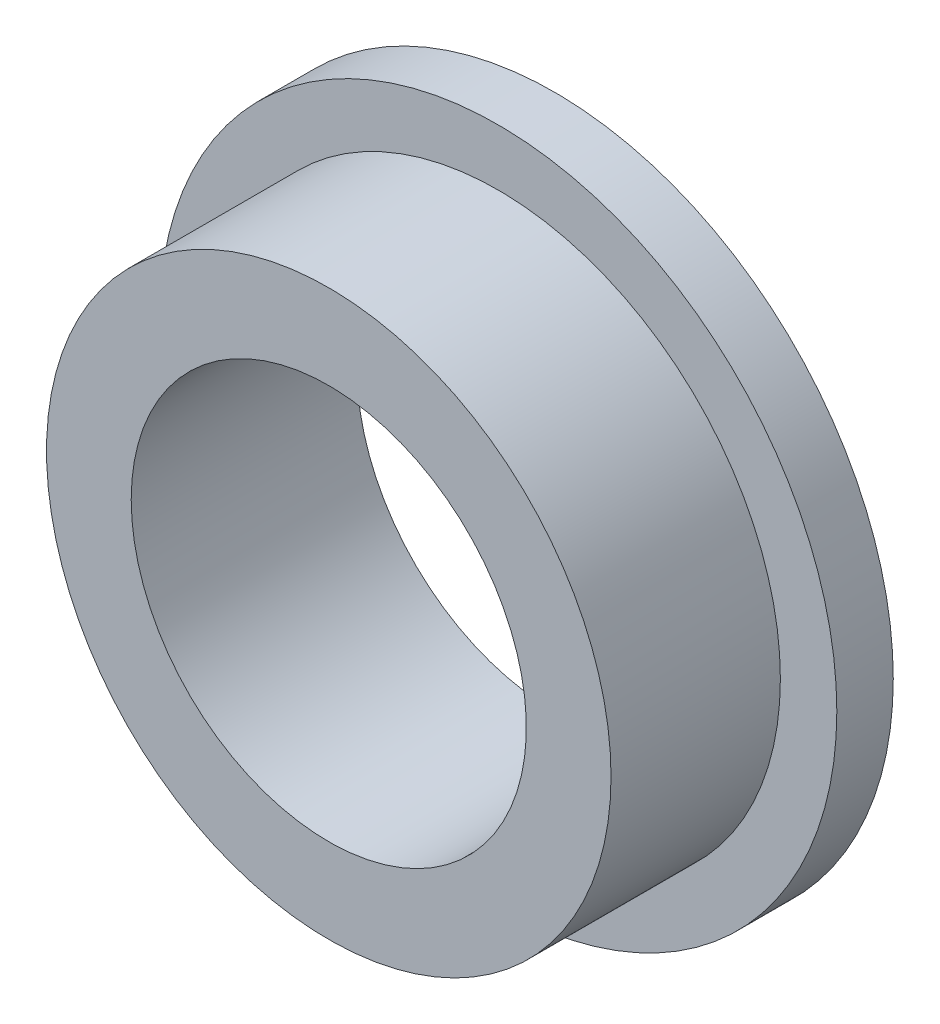
ISO-10303-21;
HEADER;
FILE_DESCRIPTION(('STEP AP214'),'2;1');
FILE_NAME('part.step','',(''),(''),'','','');
FILE_SCHEMA(('AUTOMOTIVE_DESIGN { 1 0 10303 214 1 1 1 1 }'));
ENDSEC;
DATA;
#1=APPLICATION_CONTEXT('core data for automotive mechanical design processes');
#2=APPLICATION_PROTOCOL_DEFINITION('international standard','automotive_design',2000,#1);
#3=PRODUCT_CONTEXT('',#1,'mechanical');
#4=PRODUCT('Part','Part','',(#3));
#5=PRODUCT_RELATED_PRODUCT_CATEGORY('part','',(#4));
#6=PRODUCT_DEFINITION_FORMATION('','',#4);
#7=PRODUCT_DEFINITION_CONTEXT('part definition',#1,'design');
#8=PRODUCT_DEFINITION('design','',#6,#7);
#9=PRODUCT_DEFINITION_SHAPE('','',#8);
#10=(LENGTH_UNIT() NAMED_UNIT(*) SI_UNIT(.MILLI.,.METRE.));
#11=(NAMED_UNIT(*) PLANE_ANGLE_UNIT() SI_UNIT($,.RADIAN.));
#12=(NAMED_UNIT(*) SI_UNIT($,.STERADIAN.) SOLID_ANGLE_UNIT());
#13=UNCERTAINTY_MEASURE_WITH_UNIT(LENGTH_MEASURE(1.E-05),#10,'distance_accuracy_value','');
#14=(GEOMETRIC_REPRESENTATION_CONTEXT(3) GLOBAL_UNCERTAINTY_ASSIGNED_CONTEXT((#13)) GLOBAL_UNIT_ASSIGNED_CONTEXT((#10,
#11,#12)) REPRESENTATION_CONTEXT('',''));
#15=CARTESIAN_POINT('',(0.,0.,0.));
#16=DIRECTION('',(0.,0.,1.));
#17=DIRECTION('',(1.,0.,0.));
#18=AXIS2_PLACEMENT_3D('',#15,#16,#17);
#19=CARTESIAN_POINT('',(0.,0.,1.));
#20=DIRECTION('',(0.,0.,1.));
#21=DIRECTION('',(1.,0.,0.));
#22=AXIS2_PLACEMENT_3D('',#19,#20,#21);
#23=PLANE('',#22);
#24=CARTESIAN_POINT('',(0.,0.,1.));
#25=DIRECTION('',(0.,0.,1.));
#26=DIRECTION('',(1.,0.,0.));
#27=AXIS2_PLACEMENT_3D('',#24,#25,#26);
#28=CIRCLE('',#27,6.);
#29=CARTESIAN_POINT('',(6.,0.,1.));
#30=VERTEX_POINT('',#29);
#31=EDGE_CURVE('E10',#30,#30,#28,.T.);
#32=ORIENTED_EDGE('',*,*,#31,.T.);
#33=EDGE_LOOP('',(#32));
#34=FACE_BOUND('',#33,.T.);
#35=CARTESIAN_POINT('',(0.,0.,1.));
#36=DIRECTION('',(0.,0.,1.));
#37=DIRECTION('',(1.,0.,0.));
#38=AXIS2_PLACEMENT_3D('',#35,#36,#37);
#39=CIRCLE('',#38,5.);
#40=CARTESIAN_POINT('',(5.,0.,1.));
#41=VERTEX_POINT('',#40);
#42=EDGE_CURVE('E45',#41,#41,#39,.T.);
#43=ORIENTED_EDGE('',*,*,#42,.F.);
#44=EDGE_LOOP('',(#43));
#45=FACE_BOUND('',#44,.T.);
#46=ADVANCED_FACE('F32',(#34,#45),#23,.T.);
#47=CARTESIAN_POINT('',(0.,0.,1.));
#48=DIRECTION('',(0.,0.,-1.));
#49=DIRECTION('',(-1.,0.,0.));
#50=AXIS2_PLACEMENT_3D('',#47,#48,#49);
#51=CYLINDRICAL_SURFACE('',#50,6.);
#52=ORIENTED_EDGE('',*,*,#31,.F.);
#53=EDGE_LOOP('',(#52));
#54=FACE_BOUND('',#53,.T.);
#55=CARTESIAN_POINT('',(0.,0.,0.));
#56=DIRECTION('',(0.,0.,1.));
#57=DIRECTION('',(1.,0.,0.));
#58=AXIS2_PLACEMENT_3D('',#55,#56,#57);
#59=CIRCLE('',#58,6.);
#60=CARTESIAN_POINT('',(6.,0.,0.));
#61=VERTEX_POINT('',#60);
#62=EDGE_CURVE('E36',#61,#61,#59,.T.);
#63=ORIENTED_EDGE('',*,*,#62,.T.);
#64=EDGE_LOOP('',(#63));
#65=FACE_BOUND('',#64,.T.);
#66=ADVANCED_FACE('F34',(#54,#65),#51,.T.);
#67=CARTESIAN_POINT('',(0.,0.,0.));
#68=DIRECTION('',(0.,0.,1.));
#69=DIRECTION('',(1.,0.,0.));
#70=AXIS2_PLACEMENT_3D('',#67,#68,#69);
#71=PLANE('',#70);
#72=CARTESIAN_POINT('',(0.,0.,0.));
#73=DIRECTION('',(0.,0.,-1.));
#74=DIRECTION('',(-1.,0.,0.));
#75=AXIS2_PLACEMENT_3D('',#72,#73,#74);
#76=CIRCLE('',#75,3.5);
#77=CARTESIAN_POINT('',(-3.5,0.,0.));
#78=VERTEX_POINT('',#77);
#79=EDGE_CURVE('E51',#78,#78,#76,.T.);
#80=ORIENTED_EDGE('',*,*,#79,.F.);
#81=EDGE_LOOP('',(#80));
#82=FACE_BOUND('',#81,.T.);
#83=ORIENTED_EDGE('',*,*,#62,.F.);
#84=EDGE_LOOP('',(#83));
#85=FACE_BOUND('',#84,.T.);
#86=ADVANCED_FACE('F66',(#82,#85),#71,.F.);
#87=CARTESIAN_POINT('',(0.,0.,4.));
#88=DIRECTION('',(0.,0.,-1.));
#89=DIRECTION('',(-1.,0.,0.));
#90=AXIS2_PLACEMENT_3D('',#87,#88,#89);
#91=CYLINDRICAL_SURFACE('',#90,5.);
#92=CARTESIAN_POINT('',(0.,0.,4.));
#93=DIRECTION('',(0.,0.,1.));
#94=DIRECTION('',(1.,0.,0.));
#95=AXIS2_PLACEMENT_3D('',#92,#93,#94);
#96=CIRCLE('',#95,5.);
#97=CARTESIAN_POINT('',(5.,0.,4.));
#98=VERTEX_POINT('',#97);
#99=EDGE_CURVE('E43',#98,#98,#96,.T.);
#100=ORIENTED_EDGE('',*,*,#99,.F.);
#101=EDGE_LOOP('',(#100));
#102=FACE_BOUND('',#101,.T.);
#103=ORIENTED_EDGE('',*,*,#42,.T.);
#104=EDGE_LOOP('',(#103));
#105=FACE_BOUND('',#104,.T.);
#106=ADVANCED_FACE('F69',(#102,#105),#91,.T.);
#107=CARTESIAN_POINT('',(0.,0.,4.));
#108=DIRECTION('',(0.,0.,1.));
#109=DIRECTION('',(1.,0.,0.));
#110=AXIS2_PLACEMENT_3D('',#107,#108,#109);
#111=PLANE('',#110);
#112=CARTESIAN_POINT('',(0.,0.,4.));
#113=DIRECTION('',(0.,0.,-1.));
#114=DIRECTION('',(-1.,0.,0.));
#115=AXIS2_PLACEMENT_3D('',#112,#113,#114);
#116=CIRCLE('',#115,3.5);
#117=CARTESIAN_POINT('',(-3.5,0.,4.));
#118=VERTEX_POINT('',#117);
#119=EDGE_CURVE('E48',#118,#118,#116,.T.);
#120=ORIENTED_EDGE('',*,*,#119,.T.);
#121=EDGE_LOOP('',(#120));
#122=FACE_BOUND('',#121,.T.);
#123=ORIENTED_EDGE('',*,*,#99,.T.);
#124=EDGE_LOOP('',(#123));
#125=FACE_BOUND('',#124,.T.);
#126=ADVANCED_FACE('F57',(#122,#125),#111,.T.);
#127=CARTESIAN_POINT('',(0.,0.,4.));
#128=DIRECTION('',(0.,0.,-1.));
#129=DIRECTION('',(-1.,0.,0.));
#130=AXIS2_PLACEMENT_3D('',#127,#128,#129);
#131=CYLINDRICAL_SURFACE('',#130,3.5);
#132=ORIENTED_EDGE('',*,*,#119,.F.);
#133=EDGE_LOOP('',(#132));
#134=FACE_BOUND('',#133,.T.);
#135=ORIENTED_EDGE('',*,*,#79,.T.);
#136=EDGE_LOOP('',(#135));
#137=FACE_BOUND('',#136,.T.);
#138=ADVANCED_FACE('F60',(#134,#137),#131,.F.);
#139=CLOSED_SHELL('',(#46,#66,#86,#106,#126,#138));
#140=MANIFOLD_SOLID_BREP('B2',#139);
#141=ADVANCED_BREP_SHAPE_REPRESENTATION('',(#18,#140),#14);
#142=SHAPE_DEFINITION_REPRESENTATION(#9,#141);
ENDSEC;
END-ISO-10303-21;
